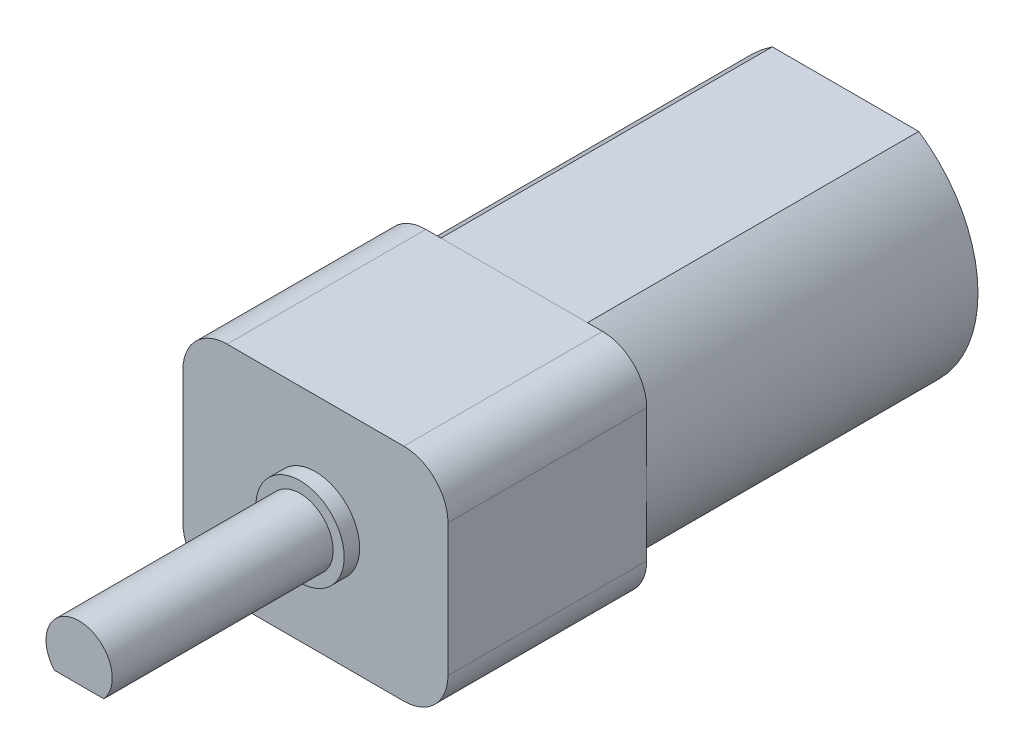
ISO-10303-21;
HEADER;
FILE_DESCRIPTION(('STEP AP214'),'2;1');
FILE_NAME('part.step','',(''),(''),'','','');
FILE_SCHEMA(('AUTOMOTIVE_DESIGN { 1 0 10303 214 1 1 1 1 }'));
ENDSEC;
DATA;
#1=APPLICATION_CONTEXT('core data for automotive mechanical design processes');
#2=APPLICATION_PROTOCOL_DEFINITION('international standard','automotive_design',2000,#1);
#3=PRODUCT_CONTEXT('',#1,'mechanical');
#4=PRODUCT('Part','Part','',(#3));
#5=PRODUCT_RELATED_PRODUCT_CATEGORY('part','',(#4));
#6=PRODUCT_DEFINITION_FORMATION('','',#4);
#7=PRODUCT_DEFINITION_CONTEXT('part definition',#1,'design');
#8=PRODUCT_DEFINITION('design','',#6,#7);
#9=PRODUCT_DEFINITION_SHAPE('','',#8);
#10=(LENGTH_UNIT() NAMED_UNIT(*) SI_UNIT(.MILLI.,.METRE.));
#11=(NAMED_UNIT(*) PLANE_ANGLE_UNIT() SI_UNIT($,.RADIAN.));
#12=(NAMED_UNIT(*) SI_UNIT($,.STERADIAN.) SOLID_ANGLE_UNIT());
#13=UNCERTAINTY_MEASURE_WITH_UNIT(LENGTH_MEASURE(1.E-05),#10,'distance_accuracy_value','');
#14=(GEOMETRIC_REPRESENTATION_CONTEXT(3) GLOBAL_UNCERTAINTY_ASSIGNED_CONTEXT((#13)) GLOBAL_UNIT_ASSIGNED_CONTEXT((#10,
#11,#12)) REPRESENTATION_CONTEXT('',''));
#15=CARTESIAN_POINT('',(0.,0.,0.));
#16=DIRECTION('',(0.,0.,1.));
#17=DIRECTION('',(1.,0.,0.));
#18=AXIS2_PLACEMENT_3D('',#15,#16,#17);
#19=CARTESIAN_POINT('',(6.,-5.,24.));
#20=DIRECTION('',(-1.,0.,0.));
#21=DIRECTION('',(0.,0.,1.));
#22=AXIS2_PLACEMENT_3D('',#19,#20,#21);
#23=PLANE('',#22);
#24=DIRECTION('',(0.,1.,0.));
#25=VECTOR('',#24,1.);
#26=CARTESIAN_POINT('',(6.,-5.,24.));
#27=LINE('',#26,#25);
#28=CARTESIAN_POINT('',(6.,-3.,24.));
#29=VERTEX_POINT('',#28);
#30=CARTESIAN_POINT('',(6.,3.,24.));
#31=VERTEX_POINT('',#30);
#32=EDGE_CURVE('E152',#29,#31,#27,.T.);
#33=ORIENTED_EDGE('',*,*,#32,.F.);
#34=DIRECTION('',(0.,0.,-1.));
#35=VECTOR('',#34,1.);
#36=CARTESIAN_POINT('',(6.,-3.,24.));
#37=LINE('',#36,#35);
#38=CARTESIAN_POINT('',(6.,-3.,15.));
#39=VERTEX_POINT('',#38);
#40=EDGE_CURVE('E198',#29,#39,#37,.T.);
#41=ORIENTED_EDGE('',*,*,#40,.T.);
#42=DIRECTION('',(0.,1.,0.));
#43=VECTOR('',#42,1.);
#44=CARTESIAN_POINT('',(6.,-5.,15.));
#45=LINE('',#44,#43);
#46=CARTESIAN_POINT('',(6.,3.,15.));
#47=VERTEX_POINT('',#46);
#48=EDGE_CURVE('E143',#39,#47,#45,.T.);
#49=ORIENTED_EDGE('',*,*,#48,.T.);
#50=DIRECTION('',(0.,0.,-1.));
#51=VECTOR('',#50,1.);
#52=CARTESIAN_POINT('',(6.,3.,24.));
#53=LINE('',#52,#51);
#54=EDGE_CURVE('E196',#47,#31,#53,.F.);
#55=ORIENTED_EDGE('',*,*,#54,.T.);
#56=EDGE_LOOP('',(#33,#41,#49,#55));
#57=FACE_BOUND('',#56,.T.);
#58=ADVANCED_FACE('F42',(#57),#23,.F.);
#59=CARTESIAN_POINT('',(-6.,5.,24.));
#60=DIRECTION('',(0.,-1.,0.));
#61=DIRECTION('',(0.,0.,-1.));
#62=AXIS2_PLACEMENT_3D('',#59,#60,#61);
#63=PLANE('',#62);
#64=DIRECTION('',(-1.,0.,0.));
#65=VECTOR('',#64,1.);
#66=CARTESIAN_POINT('',(-6.,5.,15.));
#67=LINE('',#66,#65);
#68=CARTESIAN_POINT('',(4.,5.,15.));
#69=VERTEX_POINT('',#68);
#70=CARTESIAN_POINT('',(-4.,5.,15.));
#71=VERTEX_POINT('',#70);
#72=EDGE_CURVE('E146',#69,#71,#67,.T.);
#73=ORIENTED_EDGE('',*,*,#72,.T.);
#74=DIRECTION('',(0.,0.,-1.));
#75=VECTOR('',#74,1.);
#76=CARTESIAN_POINT('',(-4.,5.,24.));
#77=LINE('',#76,#75);
#78=CARTESIAN_POINT('',(-4.,5.,24.));
#79=VERTEX_POINT('',#78);
#80=EDGE_CURVE('E46',#71,#79,#77,.F.);
#81=ORIENTED_EDGE('',*,*,#80,.T.);
#82=DIRECTION('',(-1.,0.,0.));
#83=VECTOR('',#82,1.);
#84=CARTESIAN_POINT('',(-6.,5.,24.));
#85=LINE('',#84,#83);
#86=CARTESIAN_POINT('',(4.,5.,24.));
#87=VERTEX_POINT('',#86);
#88=EDGE_CURVE('E155',#87,#79,#85,.T.);
#89=ORIENTED_EDGE('',*,*,#88,.F.);
#90=DIRECTION('',(0.,0.,-1.));
#91=VECTOR('',#90,1.);
#92=CARTESIAN_POINT('',(4.,5.,24.));
#93=LINE('',#92,#91);
#94=EDGE_CURVE('E200',#87,#69,#93,.T.);
#95=ORIENTED_EDGE('',*,*,#94,.T.);
#96=EDGE_LOOP('',(#73,#81,#89,#95));
#97=FACE_BOUND('',#96,.T.);
#98=ADVANCED_FACE('F204',(#97),#63,.F.);
#99=CARTESIAN_POINT('',(-6.,-5.,24.));
#100=DIRECTION('',(1.,0.,0.));
#101=DIRECTION('',(0.,0.,-1.));
#102=AXIS2_PLACEMENT_3D('',#99,#100,#101);
#103=PLANE('',#102);
#104=DIRECTION('',(0.,-1.,0.));
#105=VECTOR('',#104,1.);
#106=CARTESIAN_POINT('',(-6.,-5.,15.));
#107=LINE('',#106,#105);
#108=CARTESIAN_POINT('',(-6.,3.,15.));
#109=VERTEX_POINT('',#108);
#110=CARTESIAN_POINT('',(-6.,-3.,15.));
#111=VERTEX_POINT('',#110);
#112=EDGE_CURVE('E166',#109,#111,#107,.T.);
#113=ORIENTED_EDGE('',*,*,#112,.T.);
#114=DIRECTION('',(0.,0.,-1.));
#115=VECTOR('',#114,1.);
#116=CARTESIAN_POINT('',(-6.,-3.,24.));
#117=LINE('',#116,#115);
#118=CARTESIAN_POINT('',(-6.,-3.,24.));
#119=VERTEX_POINT('',#118);
#120=EDGE_CURVE('E186',#111,#119,#117,.F.);
#121=ORIENTED_EDGE('',*,*,#120,.T.);
#122=DIRECTION('',(0.,-1.,0.));
#123=VECTOR('',#122,1.);
#124=CARTESIAN_POINT('',(-6.,-5.,24.));
#125=LINE('',#124,#123);
#126=CARTESIAN_POINT('',(-6.,3.,24.));
#127=VERTEX_POINT('',#126);
#128=EDGE_CURVE('E158',#127,#119,#125,.T.);
#129=ORIENTED_EDGE('',*,*,#128,.F.);
#130=DIRECTION('',(0.,0.,-1.));
#131=VECTOR('',#130,1.);
#132=CARTESIAN_POINT('',(-6.,3.,24.));
#133=LINE('',#132,#131);
#134=EDGE_CURVE('E183',#127,#109,#133,.T.);
#135=ORIENTED_EDGE('',*,*,#134,.T.);
#136=EDGE_LOOP('',(#113,#121,#129,#135));
#137=FACE_BOUND('',#136,.T.);
#138=ADVANCED_FACE('F218',(#137),#103,.F.);
#139=CARTESIAN_POINT('',(-6.,-5.,24.));
#140=DIRECTION('',(0.,1.,0.));
#141=DIRECTION('',(0.,0.,1.));
#142=AXIS2_PLACEMENT_3D('',#139,#140,#141);
#143=PLANE('',#142);
#144=DIRECTION('',(1.,0.,0.));
#145=VECTOR('',#144,1.);
#146=CARTESIAN_POINT('',(-6.,-5.,24.));
#147=LINE('',#146,#145);
#148=CARTESIAN_POINT('',(-4.,-5.,24.));
#149=VERTEX_POINT('',#148);
#150=CARTESIAN_POINT('',(4.,-5.,24.));
#151=VERTEX_POINT('',#150);
#152=EDGE_CURVE('E161',#149,#151,#147,.T.);
#153=ORIENTED_EDGE('',*,*,#152,.F.);
#154=DIRECTION('',(0.,0.,-1.));
#155=VECTOR('',#154,1.);
#156=CARTESIAN_POINT('',(-4.,-5.,24.));
#157=LINE('',#156,#155);
#158=CARTESIAN_POINT('',(-4.,-5.,15.));
#159=VERTEX_POINT('',#158);
#160=EDGE_CURVE('E172',#149,#159,#157,.T.);
#161=ORIENTED_EDGE('',*,*,#160,.T.);
#162=DIRECTION('',(1.,0.,0.));
#163=VECTOR('',#162,1.);
#164=CARTESIAN_POINT('',(-6.,-5.,15.));
#165=LINE('',#164,#163);
#166=CARTESIAN_POINT('',(4.,-5.,15.));
#167=VERTEX_POINT('',#166);
#168=EDGE_CURVE('E156',#159,#167,#165,.T.);
#169=ORIENTED_EDGE('',*,*,#168,.T.);
#170=DIRECTION('',(0.,0.,-1.));
#171=VECTOR('',#170,1.);
#172=CARTESIAN_POINT('',(4.,-5.,24.));
#173=LINE('',#172,#171);
#174=EDGE_CURVE('E163',#167,#151,#173,.F.);
#175=ORIENTED_EDGE('',*,*,#174,.T.);
#176=EDGE_LOOP('',(#153,#161,#169,#175));
#177=FACE_BOUND('',#176,.T.);
#178=ADVANCED_FACE('F228',(#177),#143,.F.);
#179=CARTESIAN_POINT('',(0.,0.,24.));
#180=DIRECTION('',(0.,0.,-1.));
#181=DIRECTION('',(-1.,0.,0.));
#182=AXIS2_PLACEMENT_3D('',#179,#180,#181);
#183=PLANE('',#182);
#184=CARTESIAN_POINT('',(0.,0.,24.));
#185=DIRECTION('',(0.,0.,1.));
#186=DIRECTION('',(1.,0.,0.));
#187=AXIS2_PLACEMENT_3D('',#184,#185,#186);
#188=CIRCLE('',#187,2.);
#189=CARTESIAN_POINT('',(2.,0.,24.));
#190=VERTEX_POINT('',#189);
#191=EDGE_CURVE('E51',#190,#190,#188,.T.);
#192=ORIENTED_EDGE('',*,*,#191,.F.);
#193=EDGE_LOOP('',(#192));
#194=FACE_BOUND('',#193,.T.);
#195=ORIENTED_EDGE('',*,*,#128,.T.);
#196=CARTESIAN_POINT('',(-4.,-3.,24.));
#197=DIRECTION('',(0.,0.,-1.));
#198=DIRECTION('',(-1.,0.,0.));
#199=AXIS2_PLACEMENT_3D('',#196,#197,#198);
#200=CIRCLE('',#199,2.);
#201=EDGE_CURVE('E194',#119,#149,#200,.F.);
#202=ORIENTED_EDGE('',*,*,#201,.T.);
#203=ORIENTED_EDGE('',*,*,#152,.T.);
#204=CARTESIAN_POINT('',(4.,-3.,24.));
#205=DIRECTION('',(0.,0.,-1.));
#206=DIRECTION('',(-1.,0.,0.));
#207=AXIS2_PLACEMENT_3D('',#204,#205,#206);
#208=CIRCLE('',#207,2.);
#209=EDGE_CURVE('E192',#151,#29,#208,.F.);
#210=ORIENTED_EDGE('',*,*,#209,.T.);
#211=ORIENTED_EDGE('',*,*,#32,.T.);
#212=CARTESIAN_POINT('',(4.,3.,24.));
#213=DIRECTION('',(0.,0.,-1.));
#214=DIRECTION('',(-1.,0.,0.));
#215=AXIS2_PLACEMENT_3D('',#212,#213,#214);
#216=CIRCLE('',#215,2.);
#217=EDGE_CURVE('E188',#31,#87,#216,.F.);
#218=ORIENTED_EDGE('',*,*,#217,.T.);
#219=ORIENTED_EDGE('',*,*,#88,.T.);
#220=CARTESIAN_POINT('',(-4.,3.,24.));
#221=DIRECTION('',(0.,0.,-1.));
#222=DIRECTION('',(-1.,0.,0.));
#223=AXIS2_PLACEMENT_3D('',#220,#221,#222);
#224=CIRCLE('',#223,2.);
#225=EDGE_CURVE('E190',#79,#127,#224,.F.);
#226=ORIENTED_EDGE('',*,*,#225,.T.);
#227=EDGE_LOOP('',(#195,#202,#203,#210,#211,#218,#219,#226));
#228=FACE_BOUND('',#227,.T.);
#229=ADVANCED_FACE('F222',(#194,#228),#183,.F.);
#230=CARTESIAN_POINT('',(0.,0.,15.));
#231=DIRECTION('',(0.,0.,-1.));
#232=DIRECTION('',(-1.,0.,0.));
#233=AXIS2_PLACEMENT_3D('',#230,#231,#232);
#234=PLANE('',#233);
#235=ORIENTED_EDGE('',*,*,#168,.F.);
#236=CARTESIAN_POINT('',(-4.,-3.,15.));
#237=DIRECTION('',(0.,0.,-1.));
#238=DIRECTION('',(-1.,0.,0.));
#239=AXIS2_PLACEMENT_3D('',#236,#237,#238);
#240=CIRCLE('',#239,2.);
#241=EDGE_CURVE('E181',#159,#111,#240,.T.);
#242=ORIENTED_EDGE('',*,*,#241,.T.);
#243=ORIENTED_EDGE('',*,*,#112,.F.);
#244=CARTESIAN_POINT('',(-4.,3.,15.));
#245=DIRECTION('',(0.,0.,-1.));
#246=DIRECTION('',(-1.,0.,0.));
#247=AXIS2_PLACEMENT_3D('',#244,#245,#246);
#248=CIRCLE('',#247,2.);
#249=EDGE_CURVE('E177',#109,#71,#248,.T.);
#250=ORIENTED_EDGE('',*,*,#249,.T.);
#251=ORIENTED_EDGE('',*,*,#72,.F.);
#252=CARTESIAN_POINT('',(4.,3.,15.));
#253=DIRECTION('',(0.,0.,-1.));
#254=DIRECTION('',(-1.,0.,0.));
#255=AXIS2_PLACEMENT_3D('',#252,#253,#254);
#256=CIRCLE('',#255,2.);
#257=EDGE_CURVE('E175',#69,#47,#256,.T.);
#258=ORIENTED_EDGE('',*,*,#257,.T.);
#259=ORIENTED_EDGE('',*,*,#48,.F.);
#260=CARTESIAN_POINT('',(4.,-3.,15.));
#261=DIRECTION('',(0.,0.,-1.));
#262=DIRECTION('',(-1.,0.,0.));
#263=AXIS2_PLACEMENT_3D('',#260,#261,#262);
#264=CIRCLE('',#263,2.);
#265=EDGE_CURVE('E179',#39,#167,#264,.T.);
#266=ORIENTED_EDGE('',*,*,#265,.T.);
#267=EDGE_LOOP('',(#235,#242,#243,#250,#251,#258,#259,#266));
#268=FACE_BOUND('',#267,.T.);
#269=ADVANCED_FACE('F209',(#268),#234,.T.);
#270=CARTESIAN_POINT('',(-4.,-3.,24.));
#271=DIRECTION('',(0.,0.,-1.));
#272=DIRECTION('',(-1.,0.,0.));
#273=AXIS2_PLACEMENT_3D('',#270,#271,#272);
#274=CYLINDRICAL_SURFACE('',#273,2.);
#275=ORIENTED_EDGE('',*,*,#201,.F.);
#276=ORIENTED_EDGE('',*,*,#120,.F.);
#277=ORIENTED_EDGE('',*,*,#241,.F.);
#278=ORIENTED_EDGE('',*,*,#160,.F.);
#279=EDGE_LOOP('',(#275,#276,#277,#278));
#280=FACE_BOUND('',#279,.T.);
#281=ADVANCED_FACE('F226',(#280),#274,.T.);
#282=CARTESIAN_POINT('',(4.,-3.,24.));
#283=DIRECTION('',(0.,0.,-1.));
#284=DIRECTION('',(-1.,0.,0.));
#285=AXIS2_PLACEMENT_3D('',#282,#283,#284);
#286=CYLINDRICAL_SURFACE('',#285,2.);
#287=ORIENTED_EDGE('',*,*,#209,.F.);
#288=ORIENTED_EDGE('',*,*,#174,.F.);
#289=ORIENTED_EDGE('',*,*,#265,.F.);
#290=ORIENTED_EDGE('',*,*,#40,.F.);
#291=EDGE_LOOP('',(#287,#288,#289,#290));
#292=FACE_BOUND('',#291,.T.);
#293=ADVANCED_FACE('F233',(#292),#286,.T.);
#294=CARTESIAN_POINT('',(-4.,3.,24.));
#295=DIRECTION('',(0.,0.,-1.));
#296=DIRECTION('',(-1.,0.,0.));
#297=AXIS2_PLACEMENT_3D('',#294,#295,#296);
#298=CYLINDRICAL_SURFACE('',#297,2.);
#299=ORIENTED_EDGE('',*,*,#225,.F.);
#300=ORIENTED_EDGE('',*,*,#80,.F.);
#301=ORIENTED_EDGE('',*,*,#249,.F.);
#302=ORIENTED_EDGE('',*,*,#134,.F.);
#303=EDGE_LOOP('',(#299,#300,#301,#302));
#304=FACE_BOUND('',#303,.T.);
#305=ADVANCED_FACE('F215',(#304),#298,.T.);
#306=CARTESIAN_POINT('',(4.,3.,24.));
#307=DIRECTION('',(0.,0.,-1.));
#308=DIRECTION('',(-1.,0.,0.));
#309=AXIS2_PLACEMENT_3D('',#306,#307,#308);
#310=CYLINDRICAL_SURFACE('',#309,2.);
#311=ORIENTED_EDGE('',*,*,#217,.F.);
#312=ORIENTED_EDGE('',*,*,#54,.F.);
#313=ORIENTED_EDGE('',*,*,#257,.F.);
#314=ORIENTED_EDGE('',*,*,#94,.F.);
#315=EDGE_LOOP('',(#311,#312,#313,#314));
#316=FACE_BOUND('',#315,.T.);
#317=ADVANCED_FACE('F44',(#316),#310,.T.);
#318=CARTESIAN_POINT('',(0.,0.,24.7));
#319=DIRECTION('',(0.,0.,-1.));
#320=DIRECTION('',(-1.,0.,0.));
#321=AXIS2_PLACEMENT_3D('',#318,#319,#320);
#322=CYLINDRICAL_SURFACE('',#321,2.);
#323=CARTESIAN_POINT('',(0.,0.,24.7));
#324=DIRECTION('',(0.,0.,1.));
#325=DIRECTION('',(1.,0.,0.));
#326=AXIS2_PLACEMENT_3D('',#323,#324,#325);
#327=CIRCLE('',#326,2.);
#328=CARTESIAN_POINT('',(2.,0.,24.7));
#329=VERTEX_POINT('',#328);
#330=EDGE_CURVE('E141',#329,#329,#327,.T.);
#331=ORIENTED_EDGE('',*,*,#330,.F.);
#332=EDGE_LOOP('',(#331));
#333=FACE_BOUND('',#332,.T.);
#334=ORIENTED_EDGE('',*,*,#191,.T.);
#335=EDGE_LOOP('',(#334));
#336=FACE_BOUND('',#335,.T.);
#337=ADVANCED_FACE('F137',(#333,#336),#322,.T.);
#338=CARTESIAN_POINT('',(0.,0.,24.7));
#339=DIRECTION('',(0.,0.,1.));
#340=DIRECTION('',(1.,0.,0.));
#341=AXIS2_PLACEMENT_3D('',#338,#339,#340);
#342=PLANE('',#341);
#343=CARTESIAN_POINT('',(0.,0.,24.7));
#344=DIRECTION('',(0.,0.,1.));
#345=DIRECTION('',(1.,0.,0.));
#346=AXIS2_PLACEMENT_3D('',#343,#344,#345);
#347=CIRCLE('',#346,1.5);
#348=CARTESIAN_POINT('',(1.1180339887499,-1.,24.7));
#349=VERTEX_POINT('',#348);
#350=CARTESIAN_POINT('',(-1.1180339887499,-1.,24.7));
#351=VERTEX_POINT('',#350);
#352=EDGE_CURVE('E12',#349,#351,#347,.T.);
#353=ORIENTED_EDGE('',*,*,#352,.F.);
#354=DIRECTION('',(-1.,0.,0.));
#355=VECTOR('',#354,1.);
#356=CARTESIAN_POINT('',(-1.1180339887499,-1.,24.7));
#357=LINE('',#356,#355);
#358=EDGE_CURVE('E120',#349,#351,#357,.T.);
#359=ORIENTED_EDGE('',*,*,#358,.T.);
#360=EDGE_LOOP('',(#353,#359));
#361=FACE_BOUND('',#360,.T.);
#362=ORIENTED_EDGE('',*,*,#330,.T.);
#363=EDGE_LOOP('',(#362));
#364=FACE_BOUND('',#363,.T.);
#365=ADVANCED_FACE('F134',(#361,#364),#342,.T.);
#366=CARTESIAN_POINT('',(0.,0.,34.7));
#367=DIRECTION('',(0.,0.,-1.));
#368=DIRECTION('',(-1.,0.,0.));
#369=AXIS2_PLACEMENT_3D('',#366,#367,#368);
#370=CYLINDRICAL_SURFACE('',#369,1.5);
#371=CARTESIAN_POINT('',(0.,0.,34.7));
#372=DIRECTION('',(0.,0.,1.));
#373=DIRECTION('',(1.,0.,0.));
#374=AXIS2_PLACEMENT_3D('',#371,#372,#373);
#375=CIRCLE('',#374,1.5);
#376=CARTESIAN_POINT('',(1.1180339887499,-1.,34.7));
#377=VERTEX_POINT('',#376);
#378=CARTESIAN_POINT('',(-1.1180339887499,-1.,34.7));
#379=VERTEX_POINT('',#378);
#380=EDGE_CURVE('E132',#377,#379,#375,.T.);
#381=ORIENTED_EDGE('',*,*,#380,.F.);
#382=DIRECTION('',(0.,0.,1.));
#383=VECTOR('',#382,1.);
#384=CARTESIAN_POINT('',(1.1180339887499,-1.,24.7));
#385=LINE('',#384,#383);
#386=EDGE_CURVE('E59',#349,#377,#385,.T.);
#387=ORIENTED_EDGE('',*,*,#386,.F.);
#388=ORIENTED_EDGE('',*,*,#352,.T.);
#389=DIRECTION('',(0.,0.,1.));
#390=VECTOR('',#389,1.);
#391=CARTESIAN_POINT('',(-1.1180339887499,-1.,24.7));
#392=LINE('',#391,#390);
#393=EDGE_CURVE('E123',#351,#379,#392,.T.);
#394=ORIENTED_EDGE('',*,*,#393,.T.);
#395=EDGE_LOOP('',(#381,#387,#388,#394));
#396=FACE_BOUND('',#395,.T.);
#397=ADVANCED_FACE('F130',(#396),#370,.T.);
#398=CARTESIAN_POINT('',(0.,0.,34.7));
#399=DIRECTION('',(0.,0.,1.));
#400=DIRECTION('',(1.,0.,0.));
#401=AXIS2_PLACEMENT_3D('',#398,#399,#400);
#402=PLANE('',#401);
#403=DIRECTION('',(-1.,0.,0.));
#404=VECTOR('',#403,1.);
#405=CARTESIAN_POINT('',(-1.1180339887499,-1.,34.7));
#406=LINE('',#405,#404);
#407=EDGE_CURVE('E126',#377,#379,#406,.T.);
#408=ORIENTED_EDGE('',*,*,#407,.F.);
#409=ORIENTED_EDGE('',*,*,#380,.T.);
#410=EDGE_LOOP('',(#408,#409));
#411=FACE_BOUND('',#410,.T.);
#412=ADVANCED_FACE('F303',(#411),#402,.T.);
#413=CARTESIAN_POINT('',(-1.1180339887499,-1.,24.7));
#414=DIRECTION('',(0.,1.,0.));
#415=DIRECTION('',(0.,0.,1.));
#416=AXIS2_PLACEMENT_3D('',#413,#414,#415);
#417=PLANE('',#416);
#418=ORIENTED_EDGE('',*,*,#407,.T.);
#419=ORIENTED_EDGE('',*,*,#393,.F.);
#420=ORIENTED_EDGE('',*,*,#358,.F.);
#421=ORIENTED_EDGE('',*,*,#386,.T.);
#422=EDGE_LOOP('',(#418,#419,#420,#421));
#423=FACE_BOUND('',#422,.T.);
#424=ADVANCED_FACE('F121',(#423),#417,.F.);
#425=CLOSED_SHELL('',(#58,#98,#138,#178,#229,#269,#281,#293,#305,#317,#337,#365,#397,#412,#424));
#426=MANIFOLD_SOLID_BREP('B2',#425);
#427=CARTESIAN_POINT('',(-3.3166247903554,5.,15.));
#428=DIRECTION('',(0.,1.,0.));
#429=DIRECTION('',(0.,0.,1.));
#430=AXIS2_PLACEMENT_3D('',#427,#428,#429);
#431=PLANE('',#430);
#432=DIRECTION('',(1.,0.,0.));
#433=VECTOR('',#432,1.);
#434=CARTESIAN_POINT('',(-3.3166247903554,5.,0.));
#435=LINE('',#434,#433);
#436=CARTESIAN_POINT('',(-3.3166247903554,5.,0.));
#437=VERTEX_POINT('',#436);
#438=CARTESIAN_POINT('',(3.3166247903554,5.,0.));
#439=VERTEX_POINT('',#438);
#440=EDGE_CURVE('E432',#437,#439,#435,.T.);
#441=ORIENTED_EDGE('',*,*,#440,.F.);
#442=DIRECTION('',(0.,0.,-1.));
#443=VECTOR('',#442,1.);
#444=CARTESIAN_POINT('',(-3.3166247903554,5.,15.));
#445=LINE('',#444,#443);
#446=CARTESIAN_POINT('',(-3.3166247903554,5.,15.));
#447=VERTEX_POINT('',#446);
#448=EDGE_CURVE('E374',#447,#437,#445,.T.);
#449=ORIENTED_EDGE('',*,*,#448,.F.);
#450=DIRECTION('',(1.,0.,0.));
#451=VECTOR('',#450,1.);
#452=CARTESIAN_POINT('',(-3.3166247903554,5.,15.));
#453=LINE('',#452,#451);
#454=CARTESIAN_POINT('',(3.3166247903554,5.,15.));
#455=VERTEX_POINT('',#454);
#456=EDGE_CURVE('E427',#447,#455,#453,.T.);
#457=ORIENTED_EDGE('',*,*,#456,.T.);
#458=DIRECTION('',(0.,0.,-1.));
#459=VECTOR('',#458,1.);
#460=CARTESIAN_POINT('',(3.3166247903554,5.,15.));
#461=LINE('',#460,#459);
#462=EDGE_CURVE('E368',#455,#439,#461,.T.);
#463=ORIENTED_EDGE('',*,*,#462,.T.);
#464=EDGE_LOOP('',(#441,#449,#457,#463));
#465=FACE_BOUND('',#464,.T.);
#466=ADVANCED_FACE('F365',(#465),#431,.T.);
#467=CARTESIAN_POINT('',(0.,0.,15.));
#468=DIRECTION('',(0.,0.,-1.));
#469=DIRECTION('',(-1.,0.,0.));
#470=AXIS2_PLACEMENT_3D('',#467,#468,#469);
#471=CYLINDRICAL_SURFACE('',#470,6.);
#472=CARTESIAN_POINT('',(0.,0.,0.));
#473=DIRECTION('',(0.,0.,1.));
#474=DIRECTION('',(1.,0.,0.));
#475=AXIS2_PLACEMENT_3D('',#472,#473,#474);
#476=CIRCLE('',#475,6.);
#477=CARTESIAN_POINT('',(-3.3166247903554,-5.,0.));
#478=VERTEX_POINT('',#477);
#479=EDGE_CURVE('E399',#437,#478,#476,.T.);
#480=ORIENTED_EDGE('',*,*,#479,.T.);
#481=DIRECTION('',(0.,0.,-1.));
#482=VECTOR('',#481,1.);
#483=CARTESIAN_POINT('',(-3.3166247903554,-5.,15.));
#484=LINE('',#483,#482);
#485=CARTESIAN_POINT('',(-3.3166247903554,-5.,15.));
#486=VERTEX_POINT('',#485);
#487=EDGE_CURVE('E425',#486,#478,#484,.T.);
#488=ORIENTED_EDGE('',*,*,#487,.F.);
#489=CARTESIAN_POINT('',(0.,0.,15.));
#490=DIRECTION('',(0.,0.,1.));
#491=DIRECTION('',(1.,0.,0.));
#492=AXIS2_PLACEMENT_3D('',#489,#490,#491);
#493=CIRCLE('',#492,6.);
#494=EDGE_CURVE('E414',#447,#486,#493,.T.);
#495=ORIENTED_EDGE('',*,*,#494,.F.);
#496=ORIENTED_EDGE('',*,*,#448,.T.);
#497=EDGE_LOOP('',(#480,#488,#495,#496));
#498=FACE_BOUND('',#497,.T.);
#499=ADVANCED_FACE('F444',(#498),#471,.T.);
#500=CARTESIAN_POINT('',(-3.3166247903554,-5.,15.));
#501=DIRECTION('',(0.,1.,0.));
#502=DIRECTION('',(0.,0.,1.));
#503=AXIS2_PLACEMENT_3D('',#500,#501,#502);
#504=PLANE('',#503);
#505=DIRECTION('',(1.,0.,0.));
#506=VECTOR('',#505,1.);
#507=CARTESIAN_POINT('',(-3.3166247903554,-5.,0.));
#508=LINE('',#507,#506);
#509=CARTESIAN_POINT('',(3.3166247903554,-5.,0.));
#510=VERTEX_POINT('',#509);
#511=EDGE_CURVE('E421',#478,#510,#508,.T.);
#512=ORIENTED_EDGE('',*,*,#511,.T.);
#513=DIRECTION('',(0.,0.,-1.));
#514=VECTOR('',#513,1.);
#515=CARTESIAN_POINT('',(3.3166247903554,-5.,15.));
#516=LINE('',#515,#514);
#517=CARTESIAN_POINT('',(3.3166247903554,-5.,15.));
#518=VERTEX_POINT('',#517);
#519=EDGE_CURVE('E418',#518,#510,#516,.T.);
#520=ORIENTED_EDGE('',*,*,#519,.F.);
#521=DIRECTION('',(1.,0.,0.));
#522=VECTOR('',#521,1.);
#523=CARTESIAN_POINT('',(-3.3166247903554,-5.,15.));
#524=LINE('',#523,#522);
#525=EDGE_CURVE('E411',#486,#518,#524,.T.);
#526=ORIENTED_EDGE('',*,*,#525,.F.);
#527=ORIENTED_EDGE('',*,*,#487,.T.);
#528=EDGE_LOOP('',(#512,#520,#526,#527));
#529=FACE_BOUND('',#528,.T.);
#530=ADVANCED_FACE('F419',(#529),#504,.F.);
#531=CARTESIAN_POINT('',(0.,0.,15.));
#532=DIRECTION('',(0.,0.,-1.));
#533=DIRECTION('',(-1.,0.,0.));
#534=AXIS2_PLACEMENT_3D('',#531,#532,#533);
#535=CYLINDRICAL_SURFACE('',#534,6.);
#536=CARTESIAN_POINT('',(0.,0.,0.));
#537=DIRECTION('',(0.,0.,1.));
#538=DIRECTION('',(1.,0.,0.));
#539=AXIS2_PLACEMENT_3D('',#536,#537,#538);
#540=CIRCLE('',#539,6.);
#541=EDGE_CURVE('E435',#510,#439,#540,.T.);
#542=ORIENTED_EDGE('',*,*,#541,.T.);
#543=ORIENTED_EDGE('',*,*,#462,.F.);
#544=CARTESIAN_POINT('',(0.,0.,15.));
#545=DIRECTION('',(0.,0.,1.));
#546=DIRECTION('',(1.,0.,0.));
#547=AXIS2_PLACEMENT_3D('',#544,#545,#546);
#548=CIRCLE('',#547,6.);
#549=EDGE_CURVE('E408',#518,#455,#548,.T.);
#550=ORIENTED_EDGE('',*,*,#549,.F.);
#551=ORIENTED_EDGE('',*,*,#519,.T.);
#552=EDGE_LOOP('',(#542,#543,#550,#551));
#553=FACE_BOUND('',#552,.T.);
#554=ADVANCED_FACE('F426',(#553),#535,.T.);
#555=CARTESIAN_POINT('',(0.,0.,15.));
#556=DIRECTION('',(0.,0.,1.));
#557=DIRECTION('',(1.,0.,0.));
#558=AXIS2_PLACEMENT_3D('',#555,#556,#557);
#559=PLANE('',#558);
#560=ORIENTED_EDGE('',*,*,#456,.F.);
#561=ORIENTED_EDGE('',*,*,#494,.T.);
#562=ORIENTED_EDGE('',*,*,#525,.T.);
#563=ORIENTED_EDGE('',*,*,#549,.T.);
#564=EDGE_LOOP('',(#560,#561,#562,#563));
#565=FACE_BOUND('',#564,.T.);
#566=ADVANCED_FACE('F413',(#565),#559,.T.);
#567=CARTESIAN_POINT('',(0.,0.,0.));
#568=DIRECTION('',(0.,0.,1.));
#569=DIRECTION('',(1.,0.,0.));
#570=AXIS2_PLACEMENT_3D('',#567,#568,#569);
#571=PLANE('',#570);
#572=CARTESIAN_POINT('',(0.,0.,0.));
#573=DIRECTION('',(0.,0.,-1.));
#574=DIRECTION('',(-1.,0.,0.));
#575=AXIS2_PLACEMENT_3D('',#572,#573,#574);
#576=CIRCLE('',#575,2.5);
#577=CARTESIAN_POINT('',(-2.5,0.,0.));
#578=VERTEX_POINT('',#577);
#579=EDGE_CURVE('E40',#578,#578,#576,.T.);
#580=ORIENTED_EDGE('',*,*,#579,.F.);
#581=EDGE_LOOP('',(#580));
#582=FACE_BOUND('',#581,.T.);
#583=ORIENTED_EDGE('',*,*,#440,.T.);
#584=ORIENTED_EDGE('',*,*,#541,.F.);
#585=ORIENTED_EDGE('',*,*,#511,.F.);
#586=ORIENTED_EDGE('',*,*,#479,.F.);
#587=EDGE_LOOP('',(#583,#584,#585,#586));
#588=FACE_BOUND('',#587,.T.);
#589=ADVANCED_FACE('F442',(#582,#588),#571,.F.);
#590=CARTESIAN_POINT('',(0.,0.,-1.2));
#591=DIRECTION('',(0.,0.,1.));
#592=DIRECTION('',(1.,0.,0.));
#593=AXIS2_PLACEMENT_3D('',#590,#591,#592);
#594=CYLINDRICAL_SURFACE('',#593,2.5);
#595=CARTESIAN_POINT('',(0.,0.,-1.2));
#596=DIRECTION('',(0.,0.,-1.));
#597=DIRECTION('',(-1.,0.,0.));
#598=AXIS2_PLACEMENT_3D('',#595,#596,#597);
#599=CIRCLE('',#598,2.5);
#600=CARTESIAN_POINT('',(-2.5,0.,-1.2));
#601=VERTEX_POINT('',#600);
#602=EDGE_CURVE('E436',#601,#601,#599,.T.);
#603=ORIENTED_EDGE('',*,*,#602,.F.);
#604=EDGE_LOOP('',(#603));
#605=FACE_BOUND('',#604,.T.);
#606=ORIENTED_EDGE('',*,*,#579,.T.);
#607=EDGE_LOOP('',(#606));
#608=FACE_BOUND('',#607,.T.);
#609=ADVANCED_FACE('F462',(#605,#608),#594,.T.);
#610=CARTESIAN_POINT('',(0.,0.,-1.2));
#611=DIRECTION('',(0.,0.,-1.));
#612=DIRECTION('',(-1.,0.,0.));
#613=AXIS2_PLACEMENT_3D('',#610,#611,#612);
#614=PLANE('',#613);
#615=ORIENTED_EDGE('',*,*,#602,.T.);
#616=EDGE_LOOP('',(#615));
#617=FACE_BOUND('',#616,.T.);
#618=ADVANCED_FACE('F467',(#617),#614,.T.);
#619=CLOSED_SHELL('',(#466,#499,#530,#554,#566,#589,#609,#618));
#620=MANIFOLD_SOLID_BREP('B6',#619);
#621=ADVANCED_BREP_SHAPE_REPRESENTATION('',(#18,#426,#620),#14);
#622=SHAPE_DEFINITION_REPRESENTATION(#9,#621);
ENDSEC;
END-ISO-10303-21;
